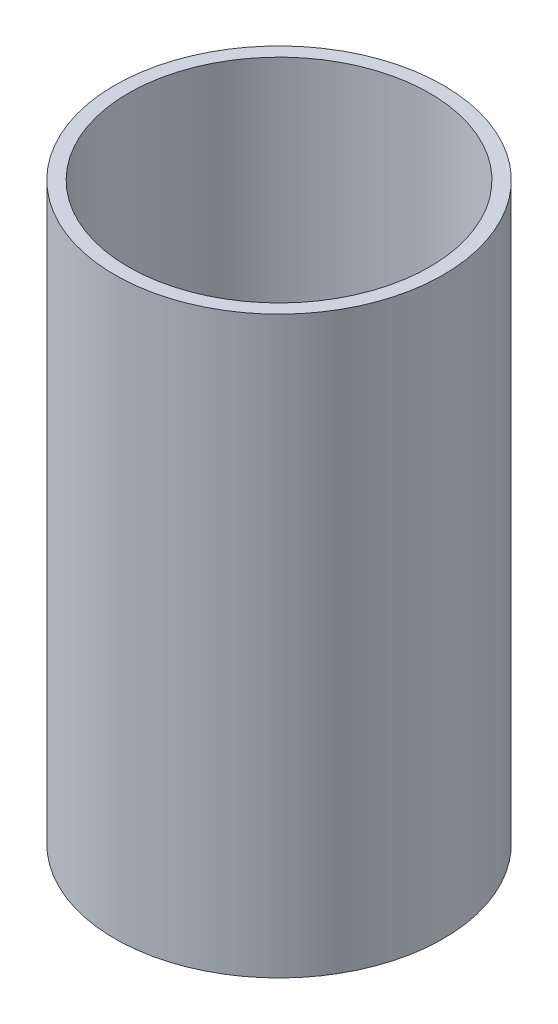
ISO-10303-21;
HEADER;
FILE_DESCRIPTION(('STEP AP214'),'2;1');
FILE_NAME('part.step','',(''),(''),'','','');
FILE_SCHEMA(('AUTOMOTIVE_DESIGN { 1 0 10303 214 1 1 1 1 }'));
ENDSEC;
DATA;
#1=APPLICATION_CONTEXT('core data for automotive mechanical design processes');
#2=APPLICATION_PROTOCOL_DEFINITION('international standard','automotive_design',2000,#1);
#3=PRODUCT_CONTEXT('',#1,'mechanical');
#4=PRODUCT('Part','Part','',(#3));
#5=PRODUCT_RELATED_PRODUCT_CATEGORY('part','',(#4));
#6=PRODUCT_DEFINITION_FORMATION('','',#4);
#7=PRODUCT_DEFINITION_CONTEXT('part definition',#1,'design');
#8=PRODUCT_DEFINITION('design','',#6,#7);
#9=PRODUCT_DEFINITION_SHAPE('','',#8);
#10=(LENGTH_UNIT() NAMED_UNIT(*) SI_UNIT(.MILLI.,.METRE.));
#11=(NAMED_UNIT(*) PLANE_ANGLE_UNIT() SI_UNIT($,.RADIAN.));
#12=(NAMED_UNIT(*) SI_UNIT($,.STERADIAN.) SOLID_ANGLE_UNIT());
#13=UNCERTAINTY_MEASURE_WITH_UNIT(LENGTH_MEASURE(1.E-05),#10,'distance_accuracy_value','');
#14=(GEOMETRIC_REPRESENTATION_CONTEXT(3) GLOBAL_UNCERTAINTY_ASSIGNED_CONTEXT((#13)) GLOBAL_UNIT_ASSIGNED_CONTEXT((#10,
#11,#12)) REPRESENTATION_CONTEXT('',''));
#15=CARTESIAN_POINT('',(0.,0.,0.));
#16=DIRECTION('',(0.,0.,1.));
#17=DIRECTION('',(1.,0.,0.));
#18=AXIS2_PLACEMENT_3D('',#15,#16,#17);
#19=CARTESIAN_POINT('',(0.,42.,0.));
#20=DIRECTION('',(0.,-1.,0.));
#21=DIRECTION('',(0.,0.,-1.));
#22=AXIS2_PLACEMENT_3D('',#19,#20,#21);
#23=CYLINDRICAL_SURFACE('',#22,12.);
#24=CARTESIAN_POINT('',(0.,42.,0.));
#25=DIRECTION('',(0.,1.,0.));
#26=DIRECTION('',(0.,0.,1.));
#27=AXIS2_PLACEMENT_3D('',#24,#25,#26);
#28=CIRCLE('',#27,12.);
#29=CARTESIAN_POINT('',(0.,42.,-12.));
#30=VERTEX_POINT('',#29);
#31=EDGE_CURVE('E10',#30,#30,#28,.T.);
#32=CARTESIAN_POINT('',(0.,0.,0.));
#33=DIRECTION('',(0.,1.,0.));
#34=DIRECTION('',(0.,0.,1.));
#35=AXIS2_PLACEMENT_3D('',#32,#33,#34);
#36=CIRCLE('',#35,12.);
#37=CARTESIAN_POINT('',(0.,0.,-12.));
#38=VERTEX_POINT('',#37);
#39=EDGE_CURVE('E38',#38,#38,#36,.T.);
#40=CARTESIAN_POINT('',(0.,42.,-12.));
#41=CARTESIAN_POINT('',(0.,41.5625,-12.));
#42=CARTESIAN_POINT('',(0.,41.125,-12.));
#43=CARTESIAN_POINT('',(0.,40.25,-12.));
#44=CARTESIAN_POINT('',(0.,39.8125,-12.));
#45=CARTESIAN_POINT('',(0.,38.9375,-12.));
#46=CARTESIAN_POINT('',(0.,38.5,-12.));
#47=CARTESIAN_POINT('',(0.,37.625,-12.));
#48=CARTESIAN_POINT('',(0.,37.1875,-12.));
#49=CARTESIAN_POINT('',(0.,36.3125,-12.));
#50=CARTESIAN_POINT('',(0.,35.875,-12.));
#51=CARTESIAN_POINT('',(0.,35.,-12.));
#52=CARTESIAN_POINT('',(0.,34.5625,-12.));
#53=CARTESIAN_POINT('',(0.,33.6875,-12.));
#54=CARTESIAN_POINT('',(0.,33.25,-12.));
#55=CARTESIAN_POINT('',(0.,32.375,-12.));
#56=CARTESIAN_POINT('',(0.,31.9375,-12.));
#57=CARTESIAN_POINT('',(0.,31.0625,-12.));
#58=CARTESIAN_POINT('',(0.,30.625,-12.));
#59=CARTESIAN_POINT('',(0.,29.75,-12.));
#60=CARTESIAN_POINT('',(0.,29.3125,-12.));
#61=CARTESIAN_POINT('',(0.,28.4375,-12.));
#62=CARTESIAN_POINT('',(0.,28.,-12.));
#63=CARTESIAN_POINT('',(0.,27.125,-12.));
#64=CARTESIAN_POINT('',(0.,26.6875,-12.));
#65=CARTESIAN_POINT('',(0.,25.8125,-12.));
#66=CARTESIAN_POINT('',(0.,25.375,-12.));
#67=CARTESIAN_POINT('',(0.,24.5,-12.));
#68=CARTESIAN_POINT('',(0.,24.0625,-12.));
#69=CARTESIAN_POINT('',(0.,23.1875,-12.));
#70=CARTESIAN_POINT('',(0.,22.75,-12.));
#71=CARTESIAN_POINT('',(0.,21.875,-12.));
#72=CARTESIAN_POINT('',(0.,21.4375,-12.));
#73=CARTESIAN_POINT('',(0.,20.5625,-12.));
#74=CARTESIAN_POINT('',(0.,20.125,-12.));
#75=CARTESIAN_POINT('',(0.,19.25,-12.));
#76=CARTESIAN_POINT('',(0.,18.8125,-12.));
#77=CARTESIAN_POINT('',(0.,17.9375,-12.));
#78=CARTESIAN_POINT('',(0.,17.5,-12.));
#79=CARTESIAN_POINT('',(0.,16.625,-12.));
#80=CARTESIAN_POINT('',(0.,16.1875,-12.));
#81=CARTESIAN_POINT('',(0.,15.3125,-12.));
#82=CARTESIAN_POINT('',(0.,14.875,-12.));
#83=CARTESIAN_POINT('',(0.,14.,-12.));
#84=CARTESIAN_POINT('',(0.,13.5625,-12.));
#85=CARTESIAN_POINT('',(0.,12.6875,-12.));
#86=CARTESIAN_POINT('',(0.,12.25,-12.));
#87=CARTESIAN_POINT('',(0.,11.375,-12.));
#88=CARTESIAN_POINT('',(0.,10.9375,-12.));
#89=CARTESIAN_POINT('',(0.,10.0625,-12.));
#90=CARTESIAN_POINT('',(0.,9.625,-12.));
#91=CARTESIAN_POINT('',(0.,8.75,-12.));
#92=CARTESIAN_POINT('',(0.,8.3125,-12.));
#93=CARTESIAN_POINT('',(0.,7.4375,-12.));
#94=CARTESIAN_POINT('',(0.,7.,-12.));
#95=CARTESIAN_POINT('',(0.,6.125,-12.));
#96=CARTESIAN_POINT('',(0.,5.6875,-12.));
#97=CARTESIAN_POINT('',(0.,4.8125,-12.));
#98=CARTESIAN_POINT('',(0.,4.375,-12.));
#99=CARTESIAN_POINT('',(0.,3.5,-12.));
#100=CARTESIAN_POINT('',(0.,3.0625,-12.));
#101=CARTESIAN_POINT('',(0.,2.1875,-12.));
#102=CARTESIAN_POINT('',(0.,1.75,-12.));
#103=CARTESIAN_POINT('',(0.,0.875000000000001,-12.));
#104=CARTESIAN_POINT('',(0.,0.4375,-12.));
#105=CARTESIAN_POINT('',(0.,0.,-12.));
#106=B_SPLINE_CURVE_WITH_KNOTS('',3,(#40,#41,#42,#43,#44,#45,#46,#47,#48,#49,#50,#51,#52,#53,
#54,#55,#56,#57,#58,#59,#60,#61,#62,#63,#64,#65,#66,#67,#68,#69,#70,#71,#72,#73,#74,#75,#76,#77,
#78,#79,#80,#81,#82,#83,#84,#85,#86,#87,#88,#89,#90,#91,#92,#93,#94,#95,#96,#97,#98,#99,#100,
#101,#102,#103,#104,#105),.UNSPECIFIED.,.F.,.F.,(4,2,2,2,2,2,2,2,2,2,2,2,2,2,2,2,2,2,2,2,2,2,2,
2,2,2,2,2,2,2,2,2,4),(0.,1.31249999999999,2.625,3.9375,5.25,6.5625,7.87499999999999,
9.18749999999999,10.5,11.8125,13.125,14.4375,15.75,17.0625,18.375,19.6875,21.,22.3125,23.625,
24.9375,26.25,27.5625,28.875,30.1875,31.5,32.8125,34.125,35.4375,36.75,38.0625,39.375,40.6875,
42.),.UNSPECIFIED.);
#107=EDGE_CURVE('BSEAM35',#30,#38,#106,.T.);
#108=ORIENTED_EDGE('',*,*,#31,.F.);
#109=ORIENTED_EDGE('',*,*,#39,.T.);
#110=ORIENTED_EDGE('',*,*,#107,.T.);
#111=ORIENTED_EDGE('',*,*,#107,.F.);
#112=EDGE_LOOP('',(#108,#110,#109,#111));
#113=FACE_BOUND('',#112,.T.);
#114=ADVANCED_FACE('F35',(#113),#23,.T.);
#115=CARTESIAN_POINT('',(0.,42.,0.));
#116=DIRECTION('',(0.,1.,0.));
#117=DIRECTION('',(0.,0.,1.));
#118=AXIS2_PLACEMENT_3D('',#115,#116,#117);
#119=PLANE('',#118);
#120=CARTESIAN_POINT('',(0.,42.,0.));
#121=DIRECTION('',(0.,1.,0.));
#122=DIRECTION('',(0.,0.,1.));
#123=AXIS2_PLACEMENT_3D('',#120,#121,#122);
#124=CIRCLE('',#123,11.);
#125=CARTESIAN_POINT('',(0.,42.,11.));
#126=VERTEX_POINT('',#125);
#127=EDGE_CURVE('E49',#126,#126,#124,.T.);
#128=ORIENTED_EDGE('',*,*,#127,.F.);
#129=EDGE_LOOP('',(#128));
#130=FACE_BOUND('',#129,.T.);
#131=ORIENTED_EDGE('',*,*,#31,.T.);
#132=EDGE_LOOP('',(#131));
#133=FACE_BOUND('',#132,.T.);
#134=ADVANCED_FACE('F56',(#130,#133),#119,.T.);
#135=CARTESIAN_POINT('',(0.,0.,0.));
#136=DIRECTION('',(0.,1.,0.));
#137=DIRECTION('',(0.,0.,1.));
#138=AXIS2_PLACEMENT_3D('',#135,#136,#137);
#139=PLANE('',#138);
#140=CARTESIAN_POINT('',(0.,0.,0.));
#141=DIRECTION('',(0.,1.,0.));
#142=DIRECTION('',(0.,0.,1.));
#143=AXIS2_PLACEMENT_3D('',#140,#141,#142);
#144=CIRCLE('',#143,11.);
#145=CARTESIAN_POINT('',(0.,0.,11.));
#146=VERTEX_POINT('',#145);
#147=EDGE_CURVE('E45',#146,#146,#144,.F.);
#148=ORIENTED_EDGE('',*,*,#147,.F.);
#149=EDGE_LOOP('',(#148));
#150=FACE_BOUND('',#149,.T.);
#151=ORIENTED_EDGE('',*,*,#39,.F.);
#152=EDGE_LOOP('',(#151));
#153=FACE_BOUND('',#152,.T.);
#154=ADVANCED_FACE('F58',(#150,#153),#139,.F.);
#155=CARTESIAN_POINT('',(0.,-0.001000000000001,0.));
#156=DIRECTION('',(0.,1.,0.));
#157=DIRECTION('',(0.,0.,1.));
#158=AXIS2_PLACEMENT_3D('',#155,#156,#157);
#159=CYLINDRICAL_SURFACE('',#158,11.);
#160=ORIENTED_EDGE('',*,*,#127,.T.);
#161=EDGE_LOOP('',(#160));
#162=FACE_BOUND('',#161,.T.);
#163=ORIENTED_EDGE('',*,*,#147,.T.);
#164=EDGE_LOOP('',(#163));
#165=FACE_BOUND('',#164,.T.);
#166=ADVANCED_FACE('F53',(#162,#165),#159,.F.);
#167=CLOSED_SHELL('',(#114,#134,#154,#166));
#168=MANIFOLD_SOLID_BREP('B2',#167);
#169=ADVANCED_BREP_SHAPE_REPRESENTATION('',(#18,#168),#14);
#170=SHAPE_DEFINITION_REPRESENTATION(#9,#169);
ENDSEC;
END-ISO-10303-21;
